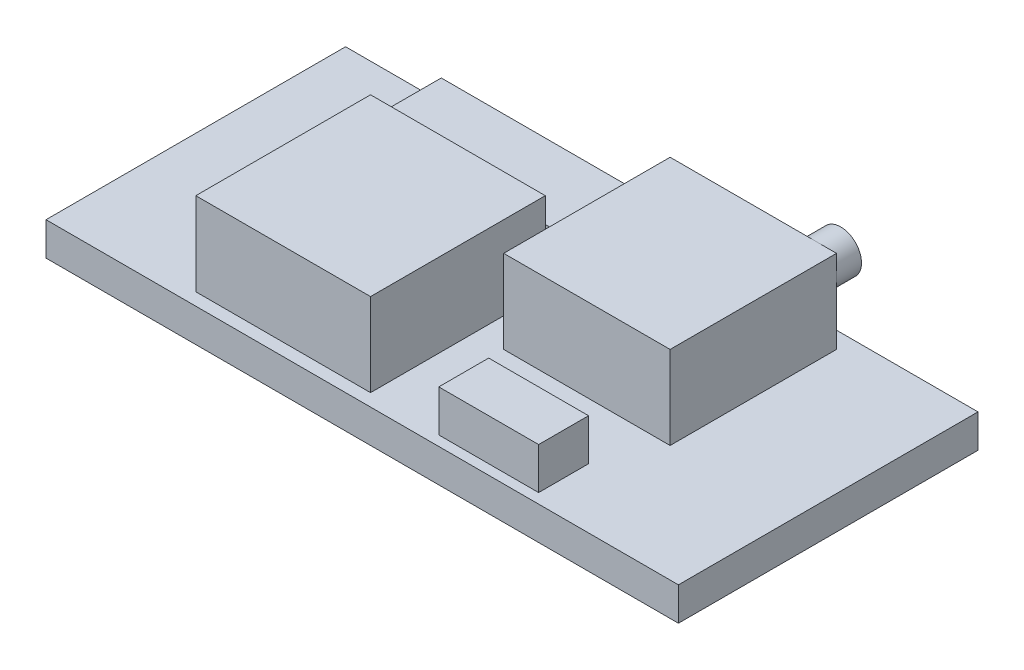
ISO-10303-21;
HEADER;
FILE_DESCRIPTION(('STEP AP214'),'2;1');
FILE_NAME('part.step','',(''),(''),'','','');
FILE_SCHEMA(('AUTOMOTIVE_DESIGN { 1 0 10303 214 1 1 1 1 }'));
ENDSEC;
DATA;
#1=APPLICATION_CONTEXT('core data for automotive mechanical design processes');
#2=APPLICATION_PROTOCOL_DEFINITION('international standard','automotive_design',2000,#1);
#3=PRODUCT_CONTEXT('',#1,'mechanical');
#4=PRODUCT('Part','Part','',(#3));
#5=PRODUCT_RELATED_PRODUCT_CATEGORY('part','',(#4));
#6=PRODUCT_DEFINITION_FORMATION('','',#4);
#7=PRODUCT_DEFINITION_CONTEXT('part definition',#1,'design');
#8=PRODUCT_DEFINITION('design','',#6,#7);
#9=PRODUCT_DEFINITION_SHAPE('','',#8);
#10=(LENGTH_UNIT() NAMED_UNIT(*) SI_UNIT(.MILLI.,.METRE.));
#11=(NAMED_UNIT(*) PLANE_ANGLE_UNIT() SI_UNIT($,.RADIAN.));
#12=(NAMED_UNIT(*) SI_UNIT($,.STERADIAN.) SOLID_ANGLE_UNIT());
#13=UNCERTAINTY_MEASURE_WITH_UNIT(LENGTH_MEASURE(1.E-05),#10,'distance_accuracy_value','');
#14=(GEOMETRIC_REPRESENTATION_CONTEXT(3) GLOBAL_UNCERTAINTY_ASSIGNED_CONTEXT((#13)) GLOBAL_UNIT_ASSIGNED_CONTEXT((#10,
#11,#12)) REPRESENTATION_CONTEXT('',''));
#15=CARTESIAN_POINT('',(0.,0.,0.));
#16=DIRECTION('',(0.,0.,1.));
#17=DIRECTION('',(1.,0.,0.));
#18=AXIS2_PLACEMENT_3D('',#15,#16,#17);
#19=CARTESIAN_POINT('',(1.5,7.,-8.));
#20=DIRECTION('',(0.,0.,1.));
#21=DIRECTION('',(1.,0.,0.));
#22=AXIS2_PLACEMENT_3D('',#19,#20,#21);
#23=PLANE('',#22);
#24=CARTESIAN_POINT('',(10.25,5.75,-8.));
#25=DIRECTION('',(0.,0.,-1.));
#26=DIRECTION('',(-1.,0.,0.));
#27=AXIS2_PLACEMENT_3D('',#24,#25,#26);
#28=CIRCLE('',#27,1.25);
#29=CARTESIAN_POINT('',(11.5,5.75,-8.));
#30=VERTEX_POINT('',#29);
#31=CARTESIAN_POINT('',(10.25,7.,-8.));
#32=VERTEX_POINT('',#31);
#33=EDGE_CURVE('E197',#30,#32,#28,.T.);
#34=ORIENTED_EDGE('',*,*,#33,.F.);
#35=DIRECTION('',(0.,-1.,0.));
#36=VECTOR('',#35,1.);
#37=CARTESIAN_POINT('',(11.5,7.,-8.));
#38=LINE('',#37,#36);
#39=CARTESIAN_POINT('',(11.5,2.,-8.));
#40=VERTEX_POINT('',#39);
#41=EDGE_CURVE('E62',#30,#40,#38,.T.);
#42=ORIENTED_EDGE('',*,*,#41,.T.);
#43=DIRECTION('',(-1.,0.,0.));
#44=VECTOR('',#43,1.);
#45=CARTESIAN_POINT('',(1.5,2.,-8.));
#46=LINE('',#45,#44);
#47=CARTESIAN_POINT('',(1.5,2.,-8.));
#48=VERTEX_POINT('',#47);
#49=EDGE_CURVE('E212',#40,#48,#46,.T.);
#50=ORIENTED_EDGE('',*,*,#49,.T.);
#51=DIRECTION('',(0.,-1.,0.));
#52=VECTOR('',#51,1.);
#53=CARTESIAN_POINT('',(1.5,7.,-8.));
#54=LINE('',#53,#52);
#55=CARTESIAN_POINT('',(1.5,7.,-8.));
#56=VERTEX_POINT('',#55);
#57=EDGE_CURVE('E188',#56,#48,#54,.T.);
#58=ORIENTED_EDGE('',*,*,#57,.F.);
#59=DIRECTION('',(-1.,0.,0.));
#60=VECTOR('',#59,1.);
#61=CARTESIAN_POINT('',(1.5,7.,-8.));
#62=LINE('',#61,#60);
#63=EDGE_CURVE('E199',#32,#56,#62,.T.);
#64=ORIENTED_EDGE('',*,*,#63,.F.);
#65=EDGE_LOOP('',(#34,#42,#50,#58,#64));
#66=FACE_BOUND('',#65,.T.);
#67=ADVANCED_FACE('F39',(#66),#23,.F.);
#68=CARTESIAN_POINT('',(0.,2.,0.));
#69=DIRECTION('',(0.,1.,0.));
#70=DIRECTION('',(0.,0.,1.));
#71=AXIS2_PLACEMENT_3D('',#68,#69,#70);
#72=PLANE('',#71);
#73=DIRECTION('',(0.,0.,1.));
#74=VECTOR('',#73,1.);
#75=CARTESIAN_POINT('',(-19.,2.,9.));
#76=LINE('',#75,#74);
#77=CARTESIAN_POINT('',(-19.,2.,-9.));
#78=VERTEX_POINT('',#77);
#79=CARTESIAN_POINT('',(-19.,2.,9.));
#80=VERTEX_POINT('',#79);
#81=EDGE_CURVE('E316',#78,#80,#76,.T.);
#82=ORIENTED_EDGE('',*,*,#81,.T.);
#83=DIRECTION('',(1.,0.,0.));
#84=VECTOR('',#83,1.);
#85=CARTESIAN_POINT('',(19.,2.,8.99999999999999));
#86=LINE('',#85,#84);
#87=CARTESIAN_POINT('',(19.,2.,8.99999999999999));
#88=VERTEX_POINT('',#87);
#89=EDGE_CURVE('E319',#80,#88,#86,.T.);
#90=ORIENTED_EDGE('',*,*,#89,.T.);
#91=DIRECTION('',(0.,0.,-1.));
#92=VECTOR('',#91,1.);
#93=CARTESIAN_POINT('',(19.,2.,8.99999999999999));
#94=LINE('',#93,#92);
#95=CARTESIAN_POINT('',(19.,2.,-9.));
#96=VERTEX_POINT('',#95);
#97=EDGE_CURVE('E322',#88,#96,#94,.T.);
#98=ORIENTED_EDGE('',*,*,#97,.T.);
#99=DIRECTION('',(-1.,0.,0.));
#100=VECTOR('',#99,1.);
#101=CARTESIAN_POINT('',(19.,2.,-9.));
#102=LINE('',#101,#100);
#103=EDGE_CURVE('E324',#96,#78,#102,.T.);
#104=ORIENTED_EDGE('',*,*,#103,.T.);
#105=EDGE_LOOP('',(#82,#90,#98,#104));
#106=FACE_BOUND('',#105,.T.);
#107=DIRECTION('',(1.,0.,0.));
#108=VECTOR('',#107,1.);
#109=CARTESIAN_POINT('',(4.,2.,8.4));
#110=LINE('',#109,#108);
#111=CARTESIAN_POINT('',(4.,2.,8.4));
#112=VERTEX_POINT('',#111);
#113=CARTESIAN_POINT('',(10.,2.,8.4));
#114=VERTEX_POINT('',#113);
#115=EDGE_CURVE('E300',#112,#114,#110,.T.);
#116=ORIENTED_EDGE('',*,*,#115,.F.);
#117=DIRECTION('',(0.,0.,1.));
#118=VECTOR('',#117,1.);
#119=CARTESIAN_POINT('',(4.,2.,5.4));
#120=LINE('',#119,#118);
#121=CARTESIAN_POINT('',(4.,2.,5.4));
#122=VERTEX_POINT('',#121);
#123=EDGE_CURVE('E279',#122,#112,#120,.T.);
#124=ORIENTED_EDGE('',*,*,#123,.F.);
#125=DIRECTION('',(-1.,0.,0.));
#126=VECTOR('',#125,1.);
#127=CARTESIAN_POINT('',(4.,2.,5.4));
#128=LINE('',#127,#126);
#129=CARTESIAN_POINT('',(10.,2.,5.4));
#130=VERTEX_POINT('',#129);
#131=EDGE_CURVE('E291',#130,#122,#128,.T.);
#132=ORIENTED_EDGE('',*,*,#131,.F.);
#133=DIRECTION('',(0.,0.,-1.));
#134=VECTOR('',#133,1.);
#135=CARTESIAN_POINT('',(10.,2.,5.4));
#136=LINE('',#135,#134);
#137=EDGE_CURVE('E302',#114,#130,#136,.T.);
#138=ORIENTED_EDGE('',*,*,#137,.F.);
#139=EDGE_LOOP('',(#116,#124,#132,#138));
#140=FACE_BOUND('',#139,.T.);
#141=DIRECTION('',(1.,0.,0.));
#142=VECTOR('',#141,1.);
#143=CARTESIAN_POINT('',(-12.,2.,-3.25));
#144=LINE('',#143,#142);
#145=CARTESIAN_POINT('',(-12.,2.,-3.25));
#146=VERTEX_POINT('',#145);
#147=CARTESIAN_POINT('',(-1.,2.,-3.25));
#148=VERTEX_POINT('',#147);
#149=EDGE_CURVE('E274',#146,#148,#144,.T.);
#150=ORIENTED_EDGE('',*,*,#149,.F.);
#151=DIRECTION('',(0.,0.,1.));
#152=VECTOR('',#151,1.);
#153=CARTESIAN_POINT('',(-12.,2.,-7.75));
#154=LINE('',#153,#152);
#155=CARTESIAN_POINT('',(-12.,2.,-7.75));
#156=VERTEX_POINT('',#155);
#157=EDGE_CURVE('E276',#156,#146,#154,.T.);
#158=ORIENTED_EDGE('',*,*,#157,.F.);
#159=DIRECTION('',(-1.,0.,0.));
#160=VECTOR('',#159,1.);
#161=CARTESIAN_POINT('',(-12.,2.,-7.75));
#162=LINE('',#161,#160);
#163=CARTESIAN_POINT('',(-0.999999999999999,2.,-7.75000000000001));
#164=VERTEX_POINT('',#163);
#165=EDGE_CURVE('E268',#164,#156,#162,.T.);
#166=ORIENTED_EDGE('',*,*,#165,.F.);
#167=DIRECTION('',(0.,0.,-1.));
#168=VECTOR('',#167,1.);
#169=CARTESIAN_POINT('',(-0.999999999999999,2.,-7.75000000000001));
#170=LINE('',#169,#168);
#171=EDGE_CURVE('E270',#148,#164,#170,.T.);
#172=ORIENTED_EDGE('',*,*,#171,.F.);
#173=EDGE_LOOP('',(#150,#158,#166,#172));
#174=FACE_BOUND('',#173,.T.);
#175=DIRECTION('',(1.,0.,0.));
#176=VECTOR('',#175,1.);
#177=CARTESIAN_POINT('',(-10.75,2.,8.25));
#178=LINE('',#177,#176);
#179=CARTESIAN_POINT('',(-10.75,2.,8.25));
#180=VERTEX_POINT('',#179);
#181=CARTESIAN_POINT('',(-0.249999999999999,2.,8.25));
#182=VERTEX_POINT('',#181);
#183=EDGE_CURVE('E242',#180,#182,#178,.T.);
#184=ORIENTED_EDGE('',*,*,#183,.F.);
#185=DIRECTION('',(0.,0.,1.));
#186=VECTOR('',#185,1.);
#187=CARTESIAN_POINT('',(-10.75,2.,-2.25));
#188=LINE('',#187,#186);
#189=CARTESIAN_POINT('',(-10.75,2.,-2.25));
#190=VERTEX_POINT('',#189);
#191=EDGE_CURVE('E221',#190,#180,#188,.T.);
#192=ORIENTED_EDGE('',*,*,#191,.F.);
#193=DIRECTION('',(-1.,0.,0.));
#194=VECTOR('',#193,1.);
#195=CARTESIAN_POINT('',(-10.75,2.,-2.25));
#196=LINE('',#195,#194);
#197=CARTESIAN_POINT('',(-0.25,2.,-2.25));
#198=VERTEX_POINT('',#197);
#199=EDGE_CURVE('E233',#198,#190,#196,.T.);
#200=ORIENTED_EDGE('',*,*,#199,.F.);
#201=DIRECTION('',(0.,0.,-1.));
#202=VECTOR('',#201,1.);
#203=CARTESIAN_POINT('',(-0.25,2.,-2.25));
#204=LINE('',#203,#202);
#205=EDGE_CURVE('E244',#182,#198,#204,.T.);
#206=ORIENTED_EDGE('',*,*,#205,.F.);
#207=EDGE_LOOP('',(#184,#192,#200,#206));
#208=FACE_BOUND('',#207,.T.);
#209=DIRECTION('',(1.,0.,0.));
#210=VECTOR('',#209,1.);
#211=CARTESIAN_POINT('',(1.5,2.,2.));
#212=LINE('',#211,#210);
#213=CARTESIAN_POINT('',(1.5,2.,2.));
#214=VERTEX_POINT('',#213);
#215=CARTESIAN_POINT('',(11.5,2.,2.));
#216=VERTEX_POINT('',#215);
#217=EDGE_CURVE('E216',#214,#216,#212,.T.);
#218=ORIENTED_EDGE('',*,*,#217,.F.);
#219=DIRECTION('',(0.,0.,1.));
#220=VECTOR('',#219,1.);
#221=CARTESIAN_POINT('',(1.5,2.,-8.));
#222=LINE('',#221,#220);
#223=EDGE_CURVE('E218',#48,#214,#222,.T.);
#224=ORIENTED_EDGE('',*,*,#223,.F.);
#225=ORIENTED_EDGE('',*,*,#49,.F.);
#226=DIRECTION('',(0.,0.,-1.));
#227=VECTOR('',#226,1.);
#228=CARTESIAN_POINT('',(11.5,2.,-8.));
#229=LINE('',#228,#227);
#230=EDGE_CURVE('E193',#216,#40,#229,.T.);
#231=ORIENTED_EDGE('',*,*,#230,.F.);
#232=EDGE_LOOP('',(#218,#224,#225,#231));
#233=FACE_BOUND('',#232,.T.);
#234=ADVANCED_FACE('F358',(#106,#140,#174,#208,#233),#72,.T.);
#235=CARTESIAN_POINT('',(-19.,2.,9.));
#236=DIRECTION('',(1.,0.,0.));
#237=DIRECTION('',(0.,0.,-1.));
#238=AXIS2_PLACEMENT_3D('',#235,#236,#237);
#239=PLANE('',#238);
#240=DIRECTION('',(0.,0.,1.));
#241=VECTOR('',#240,1.);
#242=CARTESIAN_POINT('',(-19.,0.,9.));
#243=LINE('',#242,#241);
#244=CARTESIAN_POINT('',(-19.,0.,-9.));
#245=VERTEX_POINT('',#244);
#246=CARTESIAN_POINT('',(-19.,0.,9.));
#247=VERTEX_POINT('',#246);
#248=EDGE_CURVE('E315',#245,#247,#243,.T.);
#249=ORIENTED_EDGE('',*,*,#248,.T.);
#250=DIRECTION('',(0.,-1.,0.));
#251=VECTOR('',#250,1.);
#252=CARTESIAN_POINT('',(-19.,2.,9.));
#253=LINE('',#252,#251);
#254=EDGE_CURVE('E11',#80,#247,#253,.T.);
#255=ORIENTED_EDGE('',*,*,#254,.F.);
#256=ORIENTED_EDGE('',*,*,#81,.F.);
#257=DIRECTION('',(0.,-1.,0.));
#258=VECTOR('',#257,1.);
#259=CARTESIAN_POINT('',(-19.,2.,-9.));
#260=LINE('',#259,#258);
#261=EDGE_CURVE('E326',#78,#245,#260,.T.);
#262=ORIENTED_EDGE('',*,*,#261,.T.);
#263=EDGE_LOOP('',(#249,#255,#256,#262));
#264=FACE_BOUND('',#263,.T.);
#265=ADVANCED_FACE('F41',(#264),#239,.F.);
#266=CARTESIAN_POINT('',(19.,2.,8.99999999999999));
#267=DIRECTION('',(0.,0.,-1.));
#268=DIRECTION('',(-1.,0.,0.));
#269=AXIS2_PLACEMENT_3D('',#266,#267,#268);
#270=PLANE('',#269);
#271=DIRECTION('',(1.,0.,0.));
#272=VECTOR('',#271,1.);
#273=CARTESIAN_POINT('',(19.,0.,8.99999999999999));
#274=LINE('',#273,#272);
#275=CARTESIAN_POINT('',(19.,0.,8.99999999999999));
#276=VERTEX_POINT('',#275);
#277=EDGE_CURVE('E329',#247,#276,#274,.T.);
#278=ORIENTED_EDGE('',*,*,#277,.T.);
#279=DIRECTION('',(0.,-1.,0.));
#280=VECTOR('',#279,1.);
#281=CARTESIAN_POINT('',(19.,2.,8.99999999999999));
#282=LINE('',#281,#280);
#283=EDGE_CURVE('E47',#88,#276,#282,.T.);
#284=ORIENTED_EDGE('',*,*,#283,.F.);
#285=ORIENTED_EDGE('',*,*,#89,.F.);
#286=ORIENTED_EDGE('',*,*,#254,.T.);
#287=EDGE_LOOP('',(#278,#284,#285,#286));
#288=FACE_BOUND('',#287,.T.);
#289=ADVANCED_FACE('F360',(#288),#270,.F.);
#290=CARTESIAN_POINT('',(19.,2.,8.99999999999999));
#291=DIRECTION('',(-1.,0.,0.));
#292=DIRECTION('',(0.,0.,1.));
#293=AXIS2_PLACEMENT_3D('',#290,#291,#292);
#294=PLANE('',#293);
#295=DIRECTION('',(0.,0.,-1.));
#296=VECTOR('',#295,1.);
#297=CARTESIAN_POINT('',(19.,0.,8.99999999999999));
#298=LINE('',#297,#296);
#299=CARTESIAN_POINT('',(19.,0.,-9.));
#300=VERTEX_POINT('',#299);
#301=EDGE_CURVE('E331',#276,#300,#298,.T.);
#302=ORIENTED_EDGE('',*,*,#301,.T.);
#303=DIRECTION('',(0.,-1.,0.));
#304=VECTOR('',#303,1.);
#305=CARTESIAN_POINT('',(19.,2.,-9.));
#306=LINE('',#305,#304);
#307=EDGE_CURVE('E336',#96,#300,#306,.T.);
#308=ORIENTED_EDGE('',*,*,#307,.F.);
#309=ORIENTED_EDGE('',*,*,#97,.F.);
#310=ORIENTED_EDGE('',*,*,#283,.T.);
#311=EDGE_LOOP('',(#302,#308,#309,#310));
#312=FACE_BOUND('',#311,.T.);
#313=ADVANCED_FACE('F343',(#312),#294,.F.);
#314=CARTESIAN_POINT('',(19.,2.,-9.));
#315=DIRECTION('',(0.,0.,1.));
#316=DIRECTION('',(1.,0.,0.));
#317=AXIS2_PLACEMENT_3D('',#314,#315,#316);
#318=PLANE('',#317);
#319=DIRECTION('',(-1.,0.,0.));
#320=VECTOR('',#319,1.);
#321=CARTESIAN_POINT('',(19.,0.,-9.));
#322=LINE('',#321,#320);
#323=EDGE_CURVE('E320',#300,#245,#322,.T.);
#324=ORIENTED_EDGE('',*,*,#323,.T.);
#325=ORIENTED_EDGE('',*,*,#261,.F.);
#326=ORIENTED_EDGE('',*,*,#103,.F.);
#327=ORIENTED_EDGE('',*,*,#307,.T.);
#328=EDGE_LOOP('',(#324,#325,#326,#327));
#329=FACE_BOUND('',#328,.T.);
#330=ADVANCED_FACE('F352',(#329),#318,.F.);
#331=CARTESIAN_POINT('',(0.,0.,0.));
#332=DIRECTION('',(0.,1.,0.));
#333=DIRECTION('',(0.,0.,1.));
#334=AXIS2_PLACEMENT_3D('',#331,#332,#333);
#335=PLANE('',#334);
#336=ORIENTED_EDGE('',*,*,#248,.F.);
#337=ORIENTED_EDGE('',*,*,#323,.F.);
#338=ORIENTED_EDGE('',*,*,#301,.F.);
#339=ORIENTED_EDGE('',*,*,#277,.F.);
#340=EDGE_LOOP('',(#336,#337,#338,#339));
#341=FACE_BOUND('',#340,.T.);
#342=ADVANCED_FACE('F349',(#341),#335,.F.);
#343=CARTESIAN_POINT('',(4.,4.5,5.4));
#344=DIRECTION('',(1.,0.,0.));
#345=DIRECTION('',(0.,0.,-1.));
#346=AXIS2_PLACEMENT_3D('',#343,#344,#345);
#347=PLANE('',#346);
#348=ORIENTED_EDGE('',*,*,#123,.T.);
#349=DIRECTION('',(0.,-1.,0.));
#350=VECTOR('',#349,1.);
#351=CARTESIAN_POINT('',(4.,4.5,8.4));
#352=LINE('',#351,#350);
#353=CARTESIAN_POINT('',(4.,4.5,8.4));
#354=VERTEX_POINT('',#353);
#355=EDGE_CURVE('E313',#354,#112,#352,.T.);
#356=ORIENTED_EDGE('',*,*,#355,.F.);
#357=DIRECTION('',(0.,0.,1.));
#358=VECTOR('',#357,1.);
#359=CARTESIAN_POINT('',(4.,4.5,5.4));
#360=LINE('',#359,#358);
#361=CARTESIAN_POINT('',(4.,4.5,5.4));
#362=VERTEX_POINT('',#361);
#363=EDGE_CURVE('E287',#362,#354,#360,.T.);
#364=ORIENTED_EDGE('',*,*,#363,.F.);
#365=DIRECTION('',(0.,-1.,0.));
#366=VECTOR('',#365,1.);
#367=CARTESIAN_POINT('',(4.,4.5,5.4));
#368=LINE('',#367,#366);
#369=EDGE_CURVE('E297',#362,#122,#368,.T.);
#370=ORIENTED_EDGE('',*,*,#369,.T.);
#371=EDGE_LOOP('',(#348,#356,#364,#370));
#372=FACE_BOUND('',#371,.T.);
#373=ADVANCED_FACE('F605',(#372),#347,.F.);
#374=CARTESIAN_POINT('',(4.,4.5,8.4));
#375=DIRECTION('',(0.,0.,-1.));
#376=DIRECTION('',(-1.,0.,0.));
#377=AXIS2_PLACEMENT_3D('',#374,#375,#376);
#378=PLANE('',#377);
#379=ORIENTED_EDGE('',*,*,#115,.T.);
#380=DIRECTION('',(0.,-1.,0.));
#381=VECTOR('',#380,1.);
#382=CARTESIAN_POINT('',(10.,4.5,8.4));
#383=LINE('',#382,#381);
#384=CARTESIAN_POINT('',(10.,4.5,8.4));
#385=VERTEX_POINT('',#384);
#386=EDGE_CURVE('E310',#385,#114,#383,.T.);
#387=ORIENTED_EDGE('',*,*,#386,.F.);
#388=DIRECTION('',(1.,0.,0.));
#389=VECTOR('',#388,1.);
#390=CARTESIAN_POINT('',(4.,4.5,8.4));
#391=LINE('',#390,#389);
#392=EDGE_CURVE('E290',#354,#385,#391,.T.);
#393=ORIENTED_EDGE('',*,*,#392,.F.);
#394=ORIENTED_EDGE('',*,*,#355,.T.);
#395=EDGE_LOOP('',(#379,#387,#393,#394));
#396=FACE_BOUND('',#395,.T.);
#397=ADVANCED_FACE('F595',(#396),#378,.F.);
#398=CARTESIAN_POINT('',(10.,4.5,5.4));
#399=DIRECTION('',(-1.,0.,0.));
#400=DIRECTION('',(0.,0.,1.));
#401=AXIS2_PLACEMENT_3D('',#398,#399,#400);
#402=PLANE('',#401);
#403=ORIENTED_EDGE('',*,*,#137,.T.);
#404=DIRECTION('',(0.,-1.,0.));
#405=VECTOR('',#404,1.);
#406=CARTESIAN_POINT('',(10.,4.5,5.4));
#407=LINE('',#406,#405);
#408=CARTESIAN_POINT('',(10.,4.5,5.4));
#409=VERTEX_POINT('',#408);
#410=EDGE_CURVE('E308',#409,#130,#407,.T.);
#411=ORIENTED_EDGE('',*,*,#410,.F.);
#412=DIRECTION('',(0.,0.,-1.));
#413=VECTOR('',#412,1.);
#414=CARTESIAN_POINT('',(10.,4.5,5.4));
#415=LINE('',#414,#413);
#416=EDGE_CURVE('E293',#385,#409,#415,.T.);
#417=ORIENTED_EDGE('',*,*,#416,.F.);
#418=ORIENTED_EDGE('',*,*,#386,.T.);
#419=EDGE_LOOP('',(#403,#411,#417,#418));
#420=FACE_BOUND('',#419,.T.);
#421=ADVANCED_FACE('F585',(#420),#402,.F.);
#422=CARTESIAN_POINT('',(4.,4.5,5.4));
#423=DIRECTION('',(0.,0.,1.));
#424=DIRECTION('',(1.,0.,0.));
#425=AXIS2_PLACEMENT_3D('',#422,#423,#424);
#426=PLANE('',#425);
#427=ORIENTED_EDGE('',*,*,#131,.T.);
#428=ORIENTED_EDGE('',*,*,#369,.F.);
#429=DIRECTION('',(-1.,0.,0.));
#430=VECTOR('',#429,1.);
#431=CARTESIAN_POINT('',(4.,4.5,5.4));
#432=LINE('',#431,#430);
#433=EDGE_CURVE('E295',#409,#362,#432,.T.);
#434=ORIENTED_EDGE('',*,*,#433,.F.);
#435=ORIENTED_EDGE('',*,*,#410,.T.);
#436=EDGE_LOOP('',(#427,#428,#434,#435));
#437=FACE_BOUND('',#436,.T.);
#438=ADVANCED_FACE('F575',(#437),#426,.F.);
#439=CARTESIAN_POINT('',(0.,4.5,0.));
#440=DIRECTION('',(0.,1.,0.));
#441=DIRECTION('',(0.,0.,1.));
#442=AXIS2_PLACEMENT_3D('',#439,#440,#441);
#443=PLANE('',#442);
#444=ORIENTED_EDGE('',*,*,#363,.T.);
#445=ORIENTED_EDGE('',*,*,#392,.T.);
#446=ORIENTED_EDGE('',*,*,#416,.T.);
#447=ORIENTED_EDGE('',*,*,#433,.T.);
#448=EDGE_LOOP('',(#444,#445,#446,#447));
#449=FACE_BOUND('',#448,.T.);
#450=ADVANCED_FACE('F565',(#449),#443,.T.);
#451=CARTESIAN_POINT('',(-12.,4.5,-7.75));
#452=DIRECTION('',(1.,0.,0.));
#453=DIRECTION('',(0.,0.,-1.));
#454=AXIS2_PLACEMENT_3D('',#451,#452,#453);
#455=PLANE('',#454);
#456=ORIENTED_EDGE('',*,*,#157,.T.);
#457=DIRECTION('',(0.,-1.,0.));
#458=VECTOR('',#457,1.);
#459=CARTESIAN_POINT('',(-12.,4.5,-3.25));
#460=LINE('',#459,#458);
#461=CARTESIAN_POINT('',(-12.,4.5,-3.25));
#462=VERTEX_POINT('',#461);
#463=EDGE_CURVE('E257',#462,#146,#460,.T.);
#464=ORIENTED_EDGE('',*,*,#463,.F.);
#465=DIRECTION('',(0.,0.,1.));
#466=VECTOR('',#465,1.);
#467=CARTESIAN_POINT('',(-12.,4.5,-7.75));
#468=LINE('',#467,#466);
#469=CARTESIAN_POINT('',(-12.,4.5,-7.75));
#470=VERTEX_POINT('',#469);
#471=EDGE_CURVE('E271',#470,#462,#468,.T.);
#472=ORIENTED_EDGE('',*,*,#471,.F.);
#473=DIRECTION('',(0.,-1.,0.));
#474=VECTOR('',#473,1.);
#475=CARTESIAN_POINT('',(-12.,4.5,-7.75));
#476=LINE('',#475,#474);
#477=EDGE_CURVE('E264',#470,#156,#476,.T.);
#478=ORIENTED_EDGE('',*,*,#477,.T.);
#479=EDGE_LOOP('',(#456,#464,#472,#478));
#480=FACE_BOUND('',#479,.T.);
#481=ADVANCED_FACE('F555',(#480),#455,.F.);
#482=CARTESIAN_POINT('',(-12.,4.5,-3.25));
#483=DIRECTION('',(0.,0.,-1.));
#484=DIRECTION('',(-1.,0.,0.));
#485=AXIS2_PLACEMENT_3D('',#482,#483,#484);
#486=PLANE('',#485);
#487=ORIENTED_EDGE('',*,*,#149,.T.);
#488=DIRECTION('',(0.,-1.,0.));
#489=VECTOR('',#488,1.);
#490=CARTESIAN_POINT('',(-1.,4.5,-3.25));
#491=LINE('',#490,#489);
#492=CARTESIAN_POINT('',(-1.,4.5,-3.25));
#493=VERTEX_POINT('',#492);
#494=EDGE_CURVE('E259',#493,#148,#491,.T.);
#495=ORIENTED_EDGE('',*,*,#494,.F.);
#496=DIRECTION('',(1.,0.,0.));
#497=VECTOR('',#496,1.);
#498=CARTESIAN_POINT('',(-12.,4.5,-3.25));
#499=LINE('',#498,#497);
#500=EDGE_CURVE('E283',#462,#493,#499,.T.);
#501=ORIENTED_EDGE('',*,*,#500,.F.);
#502=ORIENTED_EDGE('',*,*,#463,.T.);
#503=EDGE_LOOP('',(#487,#495,#501,#502));
#504=FACE_BOUND('',#503,.T.);
#505=ADVANCED_FACE('F545',(#504),#486,.F.);
#506=CARTESIAN_POINT('',(-0.999999999999999,4.5,-7.75000000000001));
#507=DIRECTION('',(-1.,0.,0.));
#508=DIRECTION('',(0.,0.,1.));
#509=AXIS2_PLACEMENT_3D('',#506,#507,#508);
#510=PLANE('',#509);
#511=ORIENTED_EDGE('',*,*,#171,.T.);
#512=DIRECTION('',(0.,-1.,0.));
#513=VECTOR('',#512,1.);
#514=CARTESIAN_POINT('',(-0.999999999999999,4.5,-7.75000000000001));
#515=LINE('',#514,#513);
#516=CARTESIAN_POINT('',(-0.999999999999999,4.5,-7.75000000000001));
#517=VERTEX_POINT('',#516);
#518=EDGE_CURVE('E262',#517,#164,#515,.T.);
#519=ORIENTED_EDGE('',*,*,#518,.F.);
#520=DIRECTION('',(0.,0.,-1.));
#521=VECTOR('',#520,1.);
#522=CARTESIAN_POINT('',(-0.999999999999999,4.5,-7.75000000000001));
#523=LINE('',#522,#521);
#524=EDGE_CURVE('E281',#493,#517,#523,.T.);
#525=ORIENTED_EDGE('',*,*,#524,.F.);
#526=ORIENTED_EDGE('',*,*,#494,.T.);
#527=EDGE_LOOP('',(#511,#519,#525,#526));
#528=FACE_BOUND('',#527,.T.);
#529=ADVANCED_FACE('F535',(#528),#510,.F.);
#530=CARTESIAN_POINT('',(-12.,4.5,-7.75));
#531=DIRECTION('',(0.,0.,1.));
#532=DIRECTION('',(1.,0.,0.));
#533=AXIS2_PLACEMENT_3D('',#530,#531,#532);
#534=PLANE('',#533);
#535=ORIENTED_EDGE('',*,*,#165,.T.);
#536=ORIENTED_EDGE('',*,*,#477,.F.);
#537=DIRECTION('',(-1.,0.,0.));
#538=VECTOR('',#537,1.);
#539=CARTESIAN_POINT('',(-12.,4.5,-7.75));
#540=LINE('',#539,#538);
#541=EDGE_CURVE('E267',#517,#470,#540,.T.);
#542=ORIENTED_EDGE('',*,*,#541,.F.);
#543=ORIENTED_EDGE('',*,*,#518,.T.);
#544=EDGE_LOOP('',(#535,#536,#542,#543));
#545=FACE_BOUND('',#544,.T.);
#546=ADVANCED_FACE('F525',(#545),#534,.F.);
#547=CARTESIAN_POINT('',(0.,4.5,0.));
#548=DIRECTION('',(0.,1.,0.));
#549=DIRECTION('',(0.,0.,1.));
#550=AXIS2_PLACEMENT_3D('',#547,#548,#549);
#551=PLANE('',#550);
#552=ORIENTED_EDGE('',*,*,#471,.T.);
#553=ORIENTED_EDGE('',*,*,#500,.T.);
#554=ORIENTED_EDGE('',*,*,#524,.T.);
#555=ORIENTED_EDGE('',*,*,#541,.T.);
#556=EDGE_LOOP('',(#552,#553,#554,#555));
#557=FACE_BOUND('',#556,.T.);
#558=ADVANCED_FACE('F509',(#557),#551,.T.);
#559=CARTESIAN_POINT('',(-10.75,7.,-2.25));
#560=DIRECTION('',(1.,0.,0.));
#561=DIRECTION('',(0.,0.,-1.));
#562=AXIS2_PLACEMENT_3D('',#559,#560,#561);
#563=PLANE('',#562);
#564=ORIENTED_EDGE('',*,*,#191,.T.);
#565=DIRECTION('',(0.,-1.,0.));
#566=VECTOR('',#565,1.);
#567=CARTESIAN_POINT('',(-10.75,7.,8.25));
#568=LINE('',#567,#566);
#569=CARTESIAN_POINT('',(-10.75,7.,8.25));
#570=VERTEX_POINT('',#569);
#571=EDGE_CURVE('E255',#570,#180,#568,.T.);
#572=ORIENTED_EDGE('',*,*,#571,.F.);
#573=DIRECTION('',(0.,0.,1.));
#574=VECTOR('',#573,1.);
#575=CARTESIAN_POINT('',(-10.75,7.,-2.25));
#576=LINE('',#575,#574);
#577=CARTESIAN_POINT('',(-10.75,7.,-2.25));
#578=VERTEX_POINT('',#577);
#579=EDGE_CURVE('E229',#578,#570,#576,.T.);
#580=ORIENTED_EDGE('',*,*,#579,.F.);
#581=DIRECTION('',(0.,-1.,0.));
#582=VECTOR('',#581,1.);
#583=CARTESIAN_POINT('',(-10.75,7.,-2.25));
#584=LINE('',#583,#582);
#585=EDGE_CURVE('E239',#578,#190,#584,.T.);
#586=ORIENTED_EDGE('',*,*,#585,.T.);
#587=EDGE_LOOP('',(#564,#572,#580,#586));
#588=FACE_BOUND('',#587,.T.);
#589=ADVANCED_FACE('F499',(#588),#563,.F.);
#590=CARTESIAN_POINT('',(-10.75,7.,8.25));
#591=DIRECTION('',(0.,0.,-1.));
#592=DIRECTION('',(-1.,0.,0.));
#593=AXIS2_PLACEMENT_3D('',#590,#591,#592);
#594=PLANE('',#593);
#595=ORIENTED_EDGE('',*,*,#183,.T.);
#596=DIRECTION('',(0.,-1.,0.));
#597=VECTOR('',#596,1.);
#598=CARTESIAN_POINT('',(-0.249999999999999,7.,8.25));
#599=LINE('',#598,#597);
#600=CARTESIAN_POINT('',(-0.249999999999999,7.,8.25));
#601=VERTEX_POINT('',#600);
#602=EDGE_CURVE('E252',#601,#182,#599,.T.);
#603=ORIENTED_EDGE('',*,*,#602,.F.);
#604=DIRECTION('',(1.,0.,0.));
#605=VECTOR('',#604,1.);
#606=CARTESIAN_POINT('',(-10.75,7.,8.25));
#607=LINE('',#606,#605);
#608=EDGE_CURVE('E232',#570,#601,#607,.T.);
#609=ORIENTED_EDGE('',*,*,#608,.F.);
#610=ORIENTED_EDGE('',*,*,#571,.T.);
#611=EDGE_LOOP('',(#595,#603,#609,#610));
#612=FACE_BOUND('',#611,.T.);
#613=ADVANCED_FACE('F489',(#612),#594,.F.);
#614=CARTESIAN_POINT('',(-0.25,7.,-2.25));
#615=DIRECTION('',(-1.,0.,0.));
#616=DIRECTION('',(0.,0.,1.));
#617=AXIS2_PLACEMENT_3D('',#614,#615,#616);
#618=PLANE('',#617);
#619=ORIENTED_EDGE('',*,*,#205,.T.);
#620=DIRECTION('',(0.,-1.,0.));
#621=VECTOR('',#620,1.);
#622=CARTESIAN_POINT('',(-0.25,7.,-2.25));
#623=LINE('',#622,#621);
#624=CARTESIAN_POINT('',(-0.25,7.,-2.25));
#625=VERTEX_POINT('',#624);
#626=EDGE_CURVE('E250',#625,#198,#623,.T.);
#627=ORIENTED_EDGE('',*,*,#626,.F.);
#628=DIRECTION('',(0.,0.,-1.));
#629=VECTOR('',#628,1.);
#630=CARTESIAN_POINT('',(-0.25,7.,-2.25));
#631=LINE('',#630,#629);
#632=EDGE_CURVE('E235',#601,#625,#631,.T.);
#633=ORIENTED_EDGE('',*,*,#632,.F.);
#634=ORIENTED_EDGE('',*,*,#602,.T.);
#635=EDGE_LOOP('',(#619,#627,#633,#634));
#636=FACE_BOUND('',#635,.T.);
#637=ADVANCED_FACE('F479',(#636),#618,.F.);
#638=CARTESIAN_POINT('',(-10.75,7.,-2.25));
#639=DIRECTION('',(0.,0.,1.));
#640=DIRECTION('',(1.,0.,0.));
#641=AXIS2_PLACEMENT_3D('',#638,#639,#640);
#642=PLANE('',#641);
#643=ORIENTED_EDGE('',*,*,#199,.T.);
#644=ORIENTED_EDGE('',*,*,#585,.F.);
#645=DIRECTION('',(-1.,0.,0.));
#646=VECTOR('',#645,1.);
#647=CARTESIAN_POINT('',(-10.75,7.,-2.25));
#648=LINE('',#647,#646);
#649=EDGE_CURVE('E237',#625,#578,#648,.T.);
#650=ORIENTED_EDGE('',*,*,#649,.F.);
#651=ORIENTED_EDGE('',*,*,#626,.T.);
#652=EDGE_LOOP('',(#643,#644,#650,#651));
#653=FACE_BOUND('',#652,.T.);
#654=ADVANCED_FACE('F469',(#653),#642,.F.);
#655=CARTESIAN_POINT('',(0.,7.,0.));
#656=DIRECTION('',(0.,1.,0.));
#657=DIRECTION('',(0.,0.,1.));
#658=AXIS2_PLACEMENT_3D('',#655,#656,#657);
#659=PLANE('',#658);
#660=ORIENTED_EDGE('',*,*,#579,.T.);
#661=ORIENTED_EDGE('',*,*,#608,.T.);
#662=ORIENTED_EDGE('',*,*,#632,.T.);
#663=ORIENTED_EDGE('',*,*,#649,.T.);
#664=EDGE_LOOP('',(#660,#661,#662,#663));
#665=FACE_BOUND('',#664,.T.);
#666=ADVANCED_FACE('F392',(#665),#659,.T.);
#667=CARTESIAN_POINT('',(1.5,7.,-8.));
#668=DIRECTION('',(1.,0.,0.));
#669=DIRECTION('',(0.,0.,-1.));
#670=AXIS2_PLACEMENT_3D('',#667,#668,#669);
#671=PLANE('',#670);
#672=ORIENTED_EDGE('',*,*,#223,.T.);
#673=DIRECTION('',(0.,-1.,0.));
#674=VECTOR('',#673,1.);
#675=CARTESIAN_POINT('',(1.5,7.,2.));
#676=LINE('',#675,#674);
#677=CARTESIAN_POINT('',(1.5,7.,2.));
#678=VERTEX_POINT('',#677);
#679=EDGE_CURVE('E205',#678,#214,#676,.T.);
#680=ORIENTED_EDGE('',*,*,#679,.F.);
#681=DIRECTION('',(0.,0.,1.));
#682=VECTOR('',#681,1.);
#683=CARTESIAN_POINT('',(1.5,7.,-8.));
#684=LINE('',#683,#682);
#685=EDGE_CURVE('E214',#56,#678,#684,.T.);
#686=ORIENTED_EDGE('',*,*,#685,.F.);
#687=ORIENTED_EDGE('',*,*,#57,.T.);
#688=EDGE_LOOP('',(#672,#680,#686,#687));
#689=FACE_BOUND('',#688,.T.);
#690=ADVANCED_FACE('F386',(#689),#671,.F.);
#691=CARTESIAN_POINT('',(1.5,7.,2.));
#692=DIRECTION('',(0.,0.,-1.));
#693=DIRECTION('',(-1.,0.,0.));
#694=AXIS2_PLACEMENT_3D('',#691,#692,#693);
#695=PLANE('',#694);
#696=ORIENTED_EDGE('',*,*,#217,.T.);
#697=DIRECTION('',(0.,-1.,0.));
#698=VECTOR('',#697,1.);
#699=CARTESIAN_POINT('',(11.5,7.,2.));
#700=LINE('',#699,#698);
#701=CARTESIAN_POINT('',(11.5,7.,2.));
#702=VERTEX_POINT('',#701);
#703=EDGE_CURVE('E195',#702,#216,#700,.T.);
#704=ORIENTED_EDGE('',*,*,#703,.F.);
#705=DIRECTION('',(1.,0.,0.));
#706=VECTOR('',#705,1.);
#707=CARTESIAN_POINT('',(1.5,7.,2.));
#708=LINE('',#707,#706);
#709=EDGE_CURVE('E225',#678,#702,#708,.T.);
#710=ORIENTED_EDGE('',*,*,#709,.F.);
#711=ORIENTED_EDGE('',*,*,#679,.T.);
#712=EDGE_LOOP('',(#696,#704,#710,#711));
#713=FACE_BOUND('',#712,.T.);
#714=ADVANCED_FACE('F382',(#713),#695,.F.);
#715=CARTESIAN_POINT('',(11.5,7.,-8.));
#716=DIRECTION('',(-1.,0.,0.));
#717=DIRECTION('',(0.,0.,1.));
#718=AXIS2_PLACEMENT_3D('',#715,#716,#717);
#719=PLANE('',#718);
#720=ORIENTED_EDGE('',*,*,#230,.T.);
#721=ORIENTED_EDGE('',*,*,#41,.F.);
#722=CARTESIAN_POINT('',(11.5,7.,-8.));
#723=VERTEX_POINT('',#722);
#724=EDGE_CURVE('E182',#723,#30,#38,.T.);
#725=ORIENTED_EDGE('',*,*,#724,.F.);
#726=DIRECTION('',(0.,0.,-1.));
#727=VECTOR('',#726,1.);
#728=CARTESIAN_POINT('',(11.5,7.,-8.));
#729=LINE('',#728,#727);
#730=EDGE_CURVE('E223',#702,#723,#729,.T.);
#731=ORIENTED_EDGE('',*,*,#730,.F.);
#732=ORIENTED_EDGE('',*,*,#703,.T.);
#733=EDGE_LOOP('',(#720,#721,#725,#731,#732));
#734=FACE_BOUND('',#733,.T.);
#735=ADVANCED_FACE('F190',(#734),#719,.F.);
#736=EDGE_CURVE('E54',#32,#30,#28,.T.);
#737=ORIENTED_EDGE('',*,*,#736,.F.);
#738=EDGE_CURVE('E185',#723,#32,#62,.T.);
#739=ORIENTED_EDGE('',*,*,#738,.F.);
#740=ORIENTED_EDGE('',*,*,#724,.T.);
#741=EDGE_LOOP('',(#737,#739,#740));
#742=FACE_BOUND('',#741,.T.);
#743=ADVANCED_FACE('F183',(#742),#23,.F.);
#744=CARTESIAN_POINT('',(0.,7.,0.));
#745=DIRECTION('',(0.,1.,0.));
#746=DIRECTION('',(0.,0.,1.));
#747=AXIS2_PLACEMENT_3D('',#744,#745,#746);
#748=PLANE('',#747);
#749=ORIENTED_EDGE('',*,*,#685,.T.);
#750=ORIENTED_EDGE('',*,*,#709,.T.);
#751=ORIENTED_EDGE('',*,*,#730,.T.);
#752=ORIENTED_EDGE('',*,*,#738,.T.);
#753=ORIENTED_EDGE('',*,*,#63,.T.);
#754=EDGE_LOOP('',(#749,#750,#751,#752,#753));
#755=FACE_BOUND('',#754,.T.);
#756=ADVANCED_FACE('F376',(#755),#748,.T.);
#757=CARTESIAN_POINT('',(10.25,5.75,-9.5));
#758=DIRECTION('',(0.,0.,1.));
#759=DIRECTION('',(1.,0.,0.));
#760=AXIS2_PLACEMENT_3D('',#757,#758,#759);
#761=CYLINDRICAL_SURFACE('',#760,1.25);
#762=CARTESIAN_POINT('',(10.25,5.75,-9.5));
#763=DIRECTION('',(0.,0.,-1.));
#764=DIRECTION('',(-1.,0.,0.));
#765=AXIS2_PLACEMENT_3D('',#762,#763,#764);
#766=CIRCLE('',#765,1.25);
#767=CARTESIAN_POINT('',(9.,5.75,-9.5));
#768=VERTEX_POINT('',#767);
#769=EDGE_CURVE('E203',#768,#768,#766,.T.);
#770=ORIENTED_EDGE('',*,*,#769,.F.);
#771=EDGE_LOOP('',(#770));
#772=FACE_BOUND('',#771,.T.);
#773=ORIENTED_EDGE('',*,*,#736,.T.);
#774=ORIENTED_EDGE('',*,*,#33,.T.);
#775=EDGE_LOOP('',(#773,#774));
#776=FACE_BOUND('',#775,.T.);
#777=ADVANCED_FACE('F202',(#772,#776),#761,.T.);
#778=CARTESIAN_POINT('',(10.25,5.75,-9.5));
#779=DIRECTION('',(0.,0.,-1.));
#780=DIRECTION('',(-1.,0.,0.));
#781=AXIS2_PLACEMENT_3D('',#778,#779,#780);
#782=PLANE('',#781);
#783=ORIENTED_EDGE('',*,*,#769,.T.);
#784=EDGE_LOOP('',(#783));
#785=FACE_BOUND('',#784,.T.);
#786=ADVANCED_FACE('F396',(#785),#782,.T.);
#787=CLOSED_SHELL('',(#67,#234,#265,#289,#313,#330,#342,#373,#397,#421,#438,#450,#481,#505,#529,
#546,#558,#589,#613,#637,#654,#666,#690,#714,#735,#743,#756,#777,#786));
#788=MANIFOLD_SOLID_BREP('B2',#787);
#789=ADVANCED_BREP_SHAPE_REPRESENTATION('',(#18,#788),#14);
#790=SHAPE_DEFINITION_REPRESENTATION(#9,#789);
ENDSEC;
END-ISO-10303-21;
